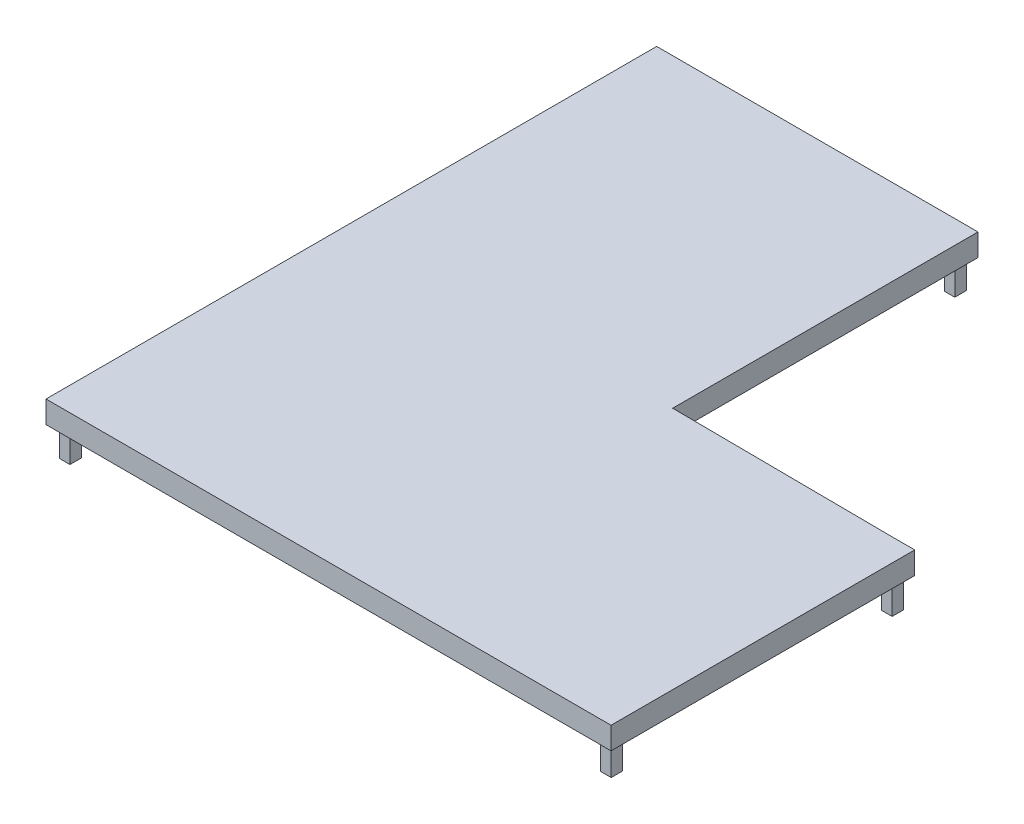
ISO-10303-21;
HEADER;
FILE_DESCRIPTION(('STEP AP214'),'2;1');
FILE_NAME('part.step','',(''),(''),'','','');
FILE_SCHEMA(('AUTOMOTIVE_DESIGN { 1 0 10303 214 1 1 1 1 }'));
ENDSEC;
DATA;
#1=APPLICATION_CONTEXT('core data for automotive mechanical design processes');
#2=APPLICATION_PROTOCOL_DEFINITION('international standard','automotive_design',2000,#1);
#3=PRODUCT_CONTEXT('',#1,'mechanical');
#4=PRODUCT('Part','Part','',(#3));
#5=PRODUCT_RELATED_PRODUCT_CATEGORY('part','',(#4));
#6=PRODUCT_DEFINITION_FORMATION('','',#4);
#7=PRODUCT_DEFINITION_CONTEXT('part definition',#1,'design');
#8=PRODUCT_DEFINITION('design','',#6,#7);
#9=PRODUCT_DEFINITION_SHAPE('','',#8);
#10=(LENGTH_UNIT() NAMED_UNIT(*) SI_UNIT(.MILLI.,.METRE.));
#11=(NAMED_UNIT(*) PLANE_ANGLE_UNIT() SI_UNIT($,.RADIAN.));
#12=(NAMED_UNIT(*) SI_UNIT($,.STERADIAN.) SOLID_ANGLE_UNIT());
#13=UNCERTAINTY_MEASURE_WITH_UNIT(LENGTH_MEASURE(1.E-05),#10,'distance_accuracy_value','');
#14=(GEOMETRIC_REPRESENTATION_CONTEXT(3) GLOBAL_UNCERTAINTY_ASSIGNED_CONTEXT((#13)) GLOBAL_UNIT_ASSIGNED_CONTEXT((#10,
#11,#12)) REPRESENTATION_CONTEXT('',''));
#15=CARTESIAN_POINT('',(0.,0.,0.));
#16=DIRECTION('',(0.,0.,1.));
#17=DIRECTION('',(1.,0.,0.));
#18=AXIS2_PLACEMENT_3D('',#15,#16,#17);
#19=CARTESIAN_POINT('',(0.,0.,0.));
#20=DIRECTION('',(0.,1.,0.));
#21=DIRECTION('',(0.,0.,1.));
#22=AXIS2_PLACEMENT_3D('',#19,#20,#21);
#23=PLANE('',#22);
#24=DIRECTION('',(-1.,0.,0.));
#25=VECTOR('',#24,1.);
#26=CARTESIAN_POINT('',(36.5271279898436,0.,10.5166417183787));
#27=LINE('',#26,#25);
#28=CARTESIAN_POINT('',(36.5271279898436,0.,10.5166417183787));
#29=VERTEX_POINT('',#28);
#30=CARTESIAN_POINT('',(32.7171279898436,0.,10.5166417183787));
#31=VERTEX_POINT('',#30);
#32=EDGE_CURVE('E316',#29,#31,#27,.T.);
#33=ORIENTED_EDGE('',*,*,#32,.F.);
#34=DIRECTION('',(0.,0.,1.));
#35=VECTOR('',#34,1.);
#36=CARTESIAN_POINT('',(36.5271279898436,0.,14.3266417183787));
#37=LINE('',#36,#35);
#38=CARTESIAN_POINT('',(36.5271279898436,0.,62.6094816829925));
#39=VERTEX_POINT('',#38);
#40=EDGE_CURVE('E328',#29,#39,#37,.T.);
#41=ORIENTED_EDGE('',*,*,#40,.T.);
#42=DIRECTION('',(-1.,0.,0.));
#43=VECTOR('',#42,1.);
#44=CARTESIAN_POINT('',(36.5271279898436,0.,62.6094816829925));
#45=LINE('',#44,#43);
#46=CARTESIAN_POINT('',(-60.4014319865656,0.,62.6094816829925));
#47=VERTEX_POINT('',#46);
#48=EDGE_CURVE('E358',#39,#47,#45,.T.);
#49=ORIENTED_EDGE('',*,*,#48,.T.);
#50=DIRECTION('',(0.,0.,-1.));
#51=VECTOR('',#50,1.);
#52=CARTESIAN_POINT('',(-60.4014319865656,0.,62.6094816829925));
#53=LINE('',#52,#51);
#54=CARTESIAN_POINT('',(-60.4014319865656,0.,-42.1433582816213));
#55=VERTEX_POINT('',#54);
#56=EDGE_CURVE('E355',#47,#55,#53,.T.);
#57=ORIENTED_EDGE('',*,*,#56,.T.);
#58=DIRECTION('',(1.,0.,0.));
#59=VECTOR('',#58,1.);
#60=CARTESIAN_POINT('',(-60.4014319865656,0.,-42.1433582816213));
#61=LINE('',#60,#59);
#62=CARTESIAN_POINT('',(-5.28143198656556,0.,-42.1433582816213));
#63=VERTEX_POINT('',#62);
#64=EDGE_CURVE('E353',#55,#63,#61,.T.);
#65=ORIENTED_EDGE('',*,*,#64,.T.);
#66=DIRECTION('',(0.,0.,-1.));
#67=VECTOR('',#66,1.);
#68=CARTESIAN_POINT('',(-5.28143198656556,0.,-38.3333582816213));
#69=LINE('',#68,#67);
#70=CARTESIAN_POINT('',(-5.28143198656556,0.,10.2330617006856));
#71=VERTEX_POINT('',#70);
#72=EDGE_CURVE('E350',#71,#63,#69,.T.);
#73=ORIENTED_EDGE('',*,*,#72,.F.);
#74=DIRECTION('',(0.999972153614113,0.,0.00746270703917655));
#75=VECTOR('',#74,1.);
#76=CARTESIAN_POINT('',(-5.28143198656556,0.,10.2330617006856));
#77=LINE('',#76,#75);
#78=EDGE_CURVE('E347',#71,#31,#77,.T.);
#79=ORIENTED_EDGE('',*,*,#78,.T.);
#80=EDGE_LOOP('',(#33,#41,#49,#57,#65,#73,#79));
#81=FACE_BOUND('',#80,.T.);
#82=DIRECTION('',(0.,0.,1.));
#83=VECTOR('',#82,1.);
#84=CARTESIAN_POINT('',(35.6745811420572,0.,0.));
#85=LINE('',#84,#83);
#86=CARTESIAN_POINT('',(35.6745811420572,0.,11.5764148682244));
#87=VERTEX_POINT('',#86);
#88=CARTESIAN_POINT('',(35.6745811420572,0.,13.5436908812878));
#89=VERTEX_POINT('',#88);
#90=EDGE_CURVE('E385',#87,#89,#85,.T.);
#91=ORIENTED_EDGE('',*,*,#90,.F.);
#92=DIRECTION('',(-1.,0.,0.));
#93=VECTOR('',#92,1.);
#94=CARTESIAN_POINT('',(0.,0.,11.5764148682244));
#95=LINE('',#94,#93);
#96=CARTESIAN_POINT('',(33.8682640755172,0.,11.5764148682244));
#97=VERTEX_POINT('',#96);
#98=EDGE_CURVE('E387',#87,#97,#95,.T.);
#99=ORIENTED_EDGE('',*,*,#98,.T.);
#100=DIRECTION('',(0.,0.,1.));
#101=VECTOR('',#100,1.);
#102=CARTESIAN_POINT('',(33.8682640755172,0.,0.));
#103=LINE('',#102,#101);
#104=CARTESIAN_POINT('',(33.8682640755172,0.,13.5436908812878));
#105=VERTEX_POINT('',#104);
#106=EDGE_CURVE('E379',#97,#105,#103,.T.);
#107=ORIENTED_EDGE('',*,*,#106,.T.);
#108=DIRECTION('',(-1.,0.,0.));
#109=VECTOR('',#108,1.);
#110=CARTESIAN_POINT('',(0.,0.,13.5436908812878));
#111=LINE('',#110,#109);
#112=EDGE_CURVE('E382',#89,#105,#111,.T.);
#113=ORIENTED_EDGE('',*,*,#112,.F.);
#114=EDGE_LOOP('',(#91,#99,#107,#113));
#115=FACE_BOUND('',#114,.T.);
#116=DIRECTION('',(0.,0.,1.));
#117=VECTOR('',#116,1.);
#118=CARTESIAN_POINT('',(-6.36491360532832,0.,0.));
#119=LINE('',#118,#117);
#120=CARTESIAN_POINT('',(-6.36491360532832,0.,-41.2194141822631));
#121=VERTEX_POINT('',#120);
#122=CARTESIAN_POINT('',(-6.36491360532832,0.,-39.2521381691998));
#123=VERTEX_POINT('',#122);
#124=EDGE_CURVE('E396',#121,#123,#119,.T.);
#125=ORIENTED_EDGE('',*,*,#124,.F.);
#126=DIRECTION('',(-1.,0.,0.));
#127=VECTOR('',#126,1.);
#128=CARTESIAN_POINT('',(0.,0.,-41.2194141822631));
#129=LINE('',#128,#127);
#130=CARTESIAN_POINT('',(-8.17123067186829,0.,-41.2194141822631));
#131=VERTEX_POINT('',#130);
#132=EDGE_CURVE('E398',#121,#131,#129,.T.);
#133=ORIENTED_EDGE('',*,*,#132,.T.);
#134=DIRECTION('',(0.,0.,1.));
#135=VECTOR('',#134,1.);
#136=CARTESIAN_POINT('',(-8.17123067186829,0.,0.));
#137=LINE('',#136,#135);
#138=CARTESIAN_POINT('',(-8.17123067186829,0.,-39.2521381691998));
#139=VERTEX_POINT('',#138);
#140=EDGE_CURVE('E390',#131,#139,#137,.T.);
#141=ORIENTED_EDGE('',*,*,#140,.T.);
#142=DIRECTION('',(-1.,0.,0.));
#143=VECTOR('',#142,1.);
#144=CARTESIAN_POINT('',(0.,0.,-39.2521381691998));
#145=LINE('',#144,#143);
#146=EDGE_CURVE('E393',#123,#139,#145,.T.);
#147=ORIENTED_EDGE('',*,*,#146,.F.);
#148=EDGE_LOOP('',(#125,#133,#141,#147));
#149=FACE_BOUND('',#148,.T.);
#150=DIRECTION('',(0.,0.,1.));
#151=VECTOR('',#150,1.);
#152=CARTESIAN_POINT('',(-57.6048939384726,0.,0.));
#153=LINE('',#152,#151);
#154=CARTESIAN_POINT('',(-57.6048939384726,0.,-40.9754424610887));
#155=VERTEX_POINT('',#154);
#156=CARTESIAN_POINT('',(-57.6048939384726,0.,-39.0081664480254));
#157=VERTEX_POINT('',#156);
#158=EDGE_CURVE('E407',#155,#157,#153,.T.);
#159=ORIENTED_EDGE('',*,*,#158,.F.);
#160=DIRECTION('',(-1.,0.,0.));
#161=VECTOR('',#160,1.);
#162=CARTESIAN_POINT('',(0.,0.,-40.9754424610887));
#163=LINE('',#162,#161);
#164=CARTESIAN_POINT('',(-59.4112110050125,0.,-40.9754424610887));
#165=VERTEX_POINT('',#164);
#166=EDGE_CURVE('E409',#155,#165,#163,.T.);
#167=ORIENTED_EDGE('',*,*,#166,.T.);
#168=DIRECTION('',(0.,0.,1.));
#169=VECTOR('',#168,1.);
#170=CARTESIAN_POINT('',(-59.4112110050125,0.,0.));
#171=LINE('',#170,#169);
#172=CARTESIAN_POINT('',(-59.4112110050125,0.,-39.0081664480254));
#173=VERTEX_POINT('',#172);
#174=EDGE_CURVE('E401',#165,#173,#171,.T.);
#175=ORIENTED_EDGE('',*,*,#174,.T.);
#176=DIRECTION('',(-1.,0.,0.));
#177=VECTOR('',#176,1.);
#178=CARTESIAN_POINT('',(0.,0.,-39.0081664480254));
#179=LINE('',#178,#177);
#180=EDGE_CURVE('E404',#157,#173,#179,.T.);
#181=ORIENTED_EDGE('',*,*,#180,.F.);
#182=EDGE_LOOP('',(#159,#167,#175,#181));
#183=FACE_BOUND('',#182,.T.);
#184=DIRECTION('',(0.,0.,1.));
#185=VECTOR('',#184,1.);
#186=CARTESIAN_POINT('',(-57.4079842203451,0.,0.));
#187=LINE('',#186,#185);
#188=CARTESIAN_POINT('',(-57.4079842203451,0.,59.5240247179649));
#189=VERTEX_POINT('',#188);
#190=CARTESIAN_POINT('',(-57.4079842203451,0.,61.4913007310282));
#191=VERTEX_POINT('',#190);
#192=EDGE_CURVE('E417',#189,#191,#187,.T.);
#193=ORIENTED_EDGE('',*,*,#192,.F.);
#194=DIRECTION('',(-1.,0.,0.));
#195=VECTOR('',#194,1.);
#196=CARTESIAN_POINT('',(0.,0.,59.5240247179649));
#197=LINE('',#196,#195);
#198=CARTESIAN_POINT('',(-59.2143012868851,0.,59.5240247179649));
#199=VERTEX_POINT('',#198);
#200=EDGE_CURVE('E419',#189,#199,#197,.T.);
#201=ORIENTED_EDGE('',*,*,#200,.T.);
#202=DIRECTION('',(0.,0.,1.));
#203=VECTOR('',#202,1.);
#204=CARTESIAN_POINT('',(-59.2143012868851,0.,0.));
#205=LINE('',#204,#203);
#206=CARTESIAN_POINT('',(-59.2143012868851,0.,61.4913007310282));
#207=VERTEX_POINT('',#206);
#208=EDGE_CURVE('E412',#199,#207,#205,.T.);
#209=ORIENTED_EDGE('',*,*,#208,.T.);
#210=DIRECTION('',(-1.,0.,0.));
#211=VECTOR('',#210,1.);
#212=CARTESIAN_POINT('',(0.,0.,61.4913007310282));
#213=LINE('',#212,#211);
#214=EDGE_CURVE('E415',#191,#207,#213,.T.);
#215=ORIENTED_EDGE('',*,*,#214,.F.);
#216=EDGE_LOOP('',(#193,#201,#209,#215));
#217=FACE_BOUND('',#216,.T.);
#218=DIRECTION('',(0.,0.,1.));
#219=VECTOR('',#218,1.);
#220=CARTESIAN_POINT('',(35.5174807960676,0.,0.));
#221=LINE('',#220,#219);
#222=CARTESIAN_POINT('',(35.5174807960676,0.,59.6059888293385));
#223=VERTEX_POINT('',#222);
#224=CARTESIAN_POINT('',(35.5174807960676,0.,61.5732648424018));
#225=VERTEX_POINT('',#224);
#226=EDGE_CURVE('E11',#223,#225,#221,.T.);
#227=ORIENTED_EDGE('',*,*,#226,.F.);
#228=DIRECTION('',(-1.,0.,0.));
#229=VECTOR('',#228,1.);
#230=CARTESIAN_POINT('',(0.,0.,59.6059888293385));
#231=LINE('',#230,#229);
#232=CARTESIAN_POINT('',(33.7111637295277,0.,59.6059888293385));
#233=VERTEX_POINT('',#232);
#234=EDGE_CURVE('E219',#223,#233,#231,.T.);
#235=ORIENTED_EDGE('',*,*,#234,.T.);
#236=DIRECTION('',(0.,0.,1.));
#237=VECTOR('',#236,1.);
#238=CARTESIAN_POINT('',(33.7111637295277,0.,0.));
#239=LINE('',#238,#237);
#240=CARTESIAN_POINT('',(33.7111637295277,0.,61.5732648424018));
#241=VERTEX_POINT('',#240);
#242=EDGE_CURVE('E423',#233,#241,#239,.T.);
#243=ORIENTED_EDGE('',*,*,#242,.T.);
#244=DIRECTION('',(-1.,0.,0.));
#245=VECTOR('',#244,1.);
#246=CARTESIAN_POINT('',(0.,0.,61.5732648424018));
#247=LINE('',#246,#245);
#248=EDGE_CURVE('E44',#225,#241,#247,.T.);
#249=ORIENTED_EDGE('',*,*,#248,.F.);
#250=EDGE_LOOP('',(#227,#235,#243,#249));
#251=FACE_BOUND('',#250,.T.);
#252=ADVANCED_FACE('F36',(#81,#115,#149,#183,#217,#251),#23,.F.);
#253=CARTESIAN_POINT('',(36.5271279898436,3.81,10.5166417183787));
#254=DIRECTION('',(0.,0.,1.));
#255=DIRECTION('',(1.,0.,0.));
#256=AXIS2_PLACEMENT_3D('',#253,#254,#255);
#257=PLANE('',#256);
#258=ORIENTED_EDGE('',*,*,#32,.T.);
#259=DIRECTION('',(0.,-1.,0.));
#260=VECTOR('',#259,1.);
#261=CARTESIAN_POINT('',(32.7171279898436,3.81,10.5166417183787));
#262=LINE('',#261,#260);
#263=CARTESIAN_POINT('',(32.7171279898436,3.81,10.5166417183787));
#264=VERTEX_POINT('',#263);
#265=EDGE_CURVE('E374',#264,#31,#262,.T.);
#266=ORIENTED_EDGE('',*,*,#265,.F.);
#267=DIRECTION('',(-1.,0.,0.));
#268=VECTOR('',#267,1.);
#269=CARTESIAN_POINT('',(36.5271279898436,3.81,10.5166417183787));
#270=LINE('',#269,#268);
#271=CARTESIAN_POINT('',(36.5271279898436,3.81,10.5166417183787));
#272=VERTEX_POINT('',#271);
#273=EDGE_CURVE('E327',#272,#264,#270,.T.);
#274=ORIENTED_EDGE('',*,*,#273,.F.);
#275=DIRECTION('',(0.,-1.,0.));
#276=VECTOR('',#275,1.);
#277=CARTESIAN_POINT('',(36.5271279898436,3.81,10.5166417183787));
#278=LINE('',#277,#276);
#279=EDGE_CURVE('E376',#272,#29,#278,.T.);
#280=ORIENTED_EDGE('',*,*,#279,.T.);
#281=EDGE_LOOP('',(#258,#266,#274,#280));
#282=FACE_BOUND('',#281,.T.);
#283=ADVANCED_FACE('F38',(#282),#257,.F.);
#284=CARTESIAN_POINT('',(-5.28143198656556,3.81,10.2330617006856));
#285=DIRECTION('',(0.00746270703917655,0.,-0.999972153614113));
#286=DIRECTION('',(-0.999972153614113,0.,-0.00746270703917655));
#287=AXIS2_PLACEMENT_3D('',#284,#285,#286);
#288=PLANE('',#287);
#289=ORIENTED_EDGE('',*,*,#78,.F.);
#290=DIRECTION('',(0.,-1.,0.));
#291=VECTOR('',#290,1.);
#292=CARTESIAN_POINT('',(-5.28143198656556,3.81,10.2330617006856));
#293=LINE('',#292,#291);
#294=CARTESIAN_POINT('',(-5.28143198656556,3.81,10.2330617006856));
#295=VERTEX_POINT('',#294);
#296=EDGE_CURVE('E371',#295,#71,#293,.T.);
#297=ORIENTED_EDGE('',*,*,#296,.F.);
#298=DIRECTION('',(0.999972153614113,0.,0.00746270703917655));
#299=VECTOR('',#298,1.);
#300=CARTESIAN_POINT('',(-5.28143198656556,3.81,10.2330617006856));
#301=LINE('',#300,#299);
#302=EDGE_CURVE('E330',#295,#264,#301,.T.);
#303=ORIENTED_EDGE('',*,*,#302,.T.);
#304=ORIENTED_EDGE('',*,*,#265,.T.);
#305=EDGE_LOOP('',(#289,#297,#303,#304));
#306=FACE_BOUND('',#305,.T.);
#307=ADVANCED_FACE('F441',(#306),#288,.T.);
#308=CARTESIAN_POINT('',(-5.28143198656556,3.81,-38.3333582816213));
#309=DIRECTION('',(-1.,0.,0.));
#310=DIRECTION('',(0.,0.,1.));
#311=AXIS2_PLACEMENT_3D('',#308,#309,#310);
#312=PLANE('',#311);
#313=ORIENTED_EDGE('',*,*,#72,.T.);
#314=DIRECTION('',(0.,-1.,0.));
#315=VECTOR('',#314,1.);
#316=CARTESIAN_POINT('',(-5.28143198656556,3.81,-42.1433582816213));
#317=LINE('',#316,#315);
#318=CARTESIAN_POINT('',(-5.28143198656556,3.81,-42.1433582816213));
#319=VERTEX_POINT('',#318);
#320=EDGE_CURVE('E368',#319,#63,#317,.T.);
#321=ORIENTED_EDGE('',*,*,#320,.F.);
#322=DIRECTION('',(0.,0.,-1.));
#323=VECTOR('',#322,1.);
#324=CARTESIAN_POINT('',(-5.28143198656556,3.81,10.2330617006856));
#325=LINE('',#324,#323);
#326=EDGE_CURVE('E333',#295,#319,#325,.T.);
#327=ORIENTED_EDGE('',*,*,#326,.F.);
#328=ORIENTED_EDGE('',*,*,#296,.T.);
#329=EDGE_LOOP('',(#313,#321,#327,#328));
#330=FACE_BOUND('',#329,.T.);
#331=ADVANCED_FACE('F464',(#330),#312,.F.);
#332=CARTESIAN_POINT('',(-60.4014319865656,3.81,-42.1433582816213));
#333=DIRECTION('',(0.,0.,-1.));
#334=DIRECTION('',(-1.,0.,0.));
#335=AXIS2_PLACEMENT_3D('',#332,#333,#334);
#336=PLANE('',#335);
#337=ORIENTED_EDGE('',*,*,#64,.F.);
#338=DIRECTION('',(0.,-1.,0.));
#339=VECTOR('',#338,1.);
#340=CARTESIAN_POINT('',(-60.4014319865656,3.81,-42.1433582816213));
#341=LINE('',#340,#339);
#342=CARTESIAN_POINT('',(-60.4014319865656,3.81,-42.1433582816213));
#343=VERTEX_POINT('',#342);
#344=EDGE_CURVE('E366',#343,#55,#341,.T.);
#345=ORIENTED_EDGE('',*,*,#344,.F.);
#346=DIRECTION('',(1.,0.,0.));
#347=VECTOR('',#346,1.);
#348=CARTESIAN_POINT('',(-9.09143198656556,3.81,-42.1433582816213));
#349=LINE('',#348,#347);
#350=EDGE_CURVE('E335',#343,#319,#349,.T.);
#351=ORIENTED_EDGE('',*,*,#350,.T.);
#352=ORIENTED_EDGE('',*,*,#320,.T.);
#353=EDGE_LOOP('',(#337,#345,#351,#352));
#354=FACE_BOUND('',#353,.T.);
#355=ADVANCED_FACE('F460',(#354),#336,.T.);
#356=CARTESIAN_POINT('',(-60.4014319865656,3.81,62.6094816829925));
#357=DIRECTION('',(-1.,0.,0.));
#358=DIRECTION('',(0.,0.,1.));
#359=AXIS2_PLACEMENT_3D('',#356,#357,#358);
#360=PLANE('',#359);
#361=ORIENTED_EDGE('',*,*,#56,.F.);
#362=DIRECTION('',(0.,-1.,0.));
#363=VECTOR('',#362,1.);
#364=CARTESIAN_POINT('',(-60.4014319865656,3.81,62.6094816829925));
#365=LINE('',#364,#363);
#366=CARTESIAN_POINT('',(-60.4014319865656,3.81,62.6094816829925));
#367=VERTEX_POINT('',#366);
#368=EDGE_CURVE('E364',#367,#47,#365,.T.);
#369=ORIENTED_EDGE('',*,*,#368,.F.);
#370=DIRECTION('',(0.,0.,-1.));
#371=VECTOR('',#370,1.);
#372=CARTESIAN_POINT('',(-60.4014319865656,3.81,62.6094816829925));
#373=LINE('',#372,#371);
#374=EDGE_CURVE('E338',#367,#343,#373,.T.);
#375=ORIENTED_EDGE('',*,*,#374,.T.);
#376=ORIENTED_EDGE('',*,*,#344,.T.);
#377=EDGE_LOOP('',(#361,#369,#375,#376));
#378=FACE_BOUND('',#377,.T.);
#379=ADVANCED_FACE('F456',(#378),#360,.T.);
#380=CARTESIAN_POINT('',(36.5271279898436,3.81,62.6094816829925));
#381=DIRECTION('',(0.,0.,1.));
#382=DIRECTION('',(1.,0.,0.));
#383=AXIS2_PLACEMENT_3D('',#380,#381,#382);
#384=PLANE('',#383);
#385=ORIENTED_EDGE('',*,*,#48,.F.);
#386=DIRECTION('',(0.,-1.,0.));
#387=VECTOR('',#386,1.);
#388=CARTESIAN_POINT('',(36.5271279898436,3.81,62.6094816829925));
#389=LINE('',#388,#387);
#390=CARTESIAN_POINT('',(36.5271279898436,3.81,62.6094816829925));
#391=VERTEX_POINT('',#390);
#392=EDGE_CURVE('E344',#391,#39,#389,.T.);
#393=ORIENTED_EDGE('',*,*,#392,.F.);
#394=DIRECTION('',(-1.,0.,0.));
#395=VECTOR('',#394,1.);
#396=CARTESIAN_POINT('',(36.5271279898436,3.81,62.6094816829925));
#397=LINE('',#396,#395);
#398=EDGE_CURVE('E341',#391,#367,#397,.T.);
#399=ORIENTED_EDGE('',*,*,#398,.T.);
#400=ORIENTED_EDGE('',*,*,#368,.T.);
#401=EDGE_LOOP('',(#385,#393,#399,#400));
#402=FACE_BOUND('',#401,.T.);
#403=ADVANCED_FACE('F452',(#402),#384,.T.);
#404=CARTESIAN_POINT('',(36.5271279898436,3.81,14.3266417183787));
#405=DIRECTION('',(1.,0.,0.));
#406=DIRECTION('',(0.,0.,-1.));
#407=AXIS2_PLACEMENT_3D('',#404,#405,#406);
#408=PLANE('',#407);
#409=ORIENTED_EDGE('',*,*,#40,.F.);
#410=ORIENTED_EDGE('',*,*,#279,.F.);
#411=DIRECTION('',(0.,0.,-1.));
#412=VECTOR('',#411,1.);
#413=CARTESIAN_POINT('',(36.5271279898436,3.81,14.3266417183787));
#414=LINE('',#413,#412);
#415=EDGE_CURVE('E324',#391,#272,#414,.T.);
#416=ORIENTED_EDGE('',*,*,#415,.F.);
#417=ORIENTED_EDGE('',*,*,#392,.T.);
#418=EDGE_LOOP('',(#409,#410,#416,#417));
#419=FACE_BOUND('',#418,.T.);
#420=ADVANCED_FACE('F449',(#419),#408,.T.);
#421=CARTESIAN_POINT('',(0.,3.81,0.));
#422=DIRECTION('',(0.,1.,0.));
#423=DIRECTION('',(0.,0.,1.));
#424=AXIS2_PLACEMENT_3D('',#421,#422,#423);
#425=PLANE('',#424);
#426=ORIENTED_EDGE('',*,*,#415,.T.);
#427=ORIENTED_EDGE('',*,*,#273,.T.);
#428=ORIENTED_EDGE('',*,*,#302,.F.);
#429=ORIENTED_EDGE('',*,*,#326,.T.);
#430=ORIENTED_EDGE('',*,*,#350,.F.);
#431=ORIENTED_EDGE('',*,*,#374,.F.);
#432=ORIENTED_EDGE('',*,*,#398,.F.);
#433=EDGE_LOOP('',(#426,#427,#428,#429,#430,#431,#432));
#434=FACE_BOUND('',#433,.T.);
#435=ADVANCED_FACE('F447',(#434),#425,.T.);
#436=CARTESIAN_POINT('',(0.,-4.99,11.5764148682244));
#437=DIRECTION('',(0.,0.,-1.));
#438=DIRECTION('',(-1.,0.,0.));
#439=AXIS2_PLACEMENT_3D('',#436,#437,#438);
#440=PLANE('',#439);
#441=ORIENTED_EDGE('',*,*,#98,.F.);
#442=DIRECTION('',(0.,1.,0.));
#443=VECTOR('',#442,1.);
#444=CARTESIAN_POINT('',(35.6745811420572,-4.99,11.5764148682244));
#445=LINE('',#444,#443);
#446=CARTESIAN_POINT('',(35.6745811420572,-4.99,11.5764148682244));
#447=VERTEX_POINT('',#446);
#448=EDGE_CURVE('E313',#447,#87,#445,.T.);
#449=ORIENTED_EDGE('',*,*,#448,.F.);
#450=DIRECTION('',(-1.,0.,0.));
#451=VECTOR('',#450,1.);
#452=CARTESIAN_POINT('',(0.,-4.99,11.5764148682244));
#453=LINE('',#452,#451);
#454=CARTESIAN_POINT('',(33.8682640755172,-4.99,11.5764148682244));
#455=VERTEX_POINT('',#454);
#456=EDGE_CURVE('E302',#447,#455,#453,.T.);
#457=ORIENTED_EDGE('',*,*,#456,.T.);
#458=DIRECTION('',(0.,1.,0.));
#459=VECTOR('',#458,1.);
#460=CARTESIAN_POINT('',(33.8682640755172,-4.99,11.5764148682244));
#461=LINE('',#460,#459);
#462=EDGE_CURVE('E312',#455,#97,#461,.T.);
#463=ORIENTED_EDGE('',*,*,#462,.T.);
#464=EDGE_LOOP('',(#441,#449,#457,#463));
#465=FACE_BOUND('',#464,.T.);
#466=ADVANCED_FACE('F487',(#465),#440,.T.);
#467=CARTESIAN_POINT('',(35.6745811420572,-4.99,0.));
#468=DIRECTION('',(-1.,0.,0.));
#469=DIRECTION('',(0.,0.,1.));
#470=AXIS2_PLACEMENT_3D('',#467,#468,#469);
#471=PLANE('',#470);
#472=ORIENTED_EDGE('',*,*,#448,.T.);
#473=ORIENTED_EDGE('',*,*,#90,.T.);
#474=DIRECTION('',(0.,1.,0.));
#475=VECTOR('',#474,1.);
#476=CARTESIAN_POINT('',(35.6745811420572,-4.99,13.5436908812878));
#477=LINE('',#476,#475);
#478=CARTESIAN_POINT('',(35.6745811420572,-4.99,13.5436908812878));
#479=VERTEX_POINT('',#478);
#480=EDGE_CURVE('E317',#479,#89,#477,.T.);
#481=ORIENTED_EDGE('',*,*,#480,.F.);
#482=DIRECTION('',(0.,0.,1.));
#483=VECTOR('',#482,1.);
#484=CARTESIAN_POINT('',(35.6745811420572,-4.99,0.));
#485=LINE('',#484,#483);
#486=EDGE_CURVE('E310',#447,#479,#485,.T.);
#487=ORIENTED_EDGE('',*,*,#486,.F.);
#488=EDGE_LOOP('',(#472,#473,#481,#487));
#489=FACE_BOUND('',#488,.T.);
#490=ADVANCED_FACE('F491',(#489),#471,.F.);
#491=CARTESIAN_POINT('',(0.,-4.99,13.5436908812878));
#492=DIRECTION('',(0.,0.,-1.));
#493=DIRECTION('',(-1.,0.,0.));
#494=AXIS2_PLACEMENT_3D('',#491,#492,#493);
#495=PLANE('',#494);
#496=ORIENTED_EDGE('',*,*,#480,.T.);
#497=ORIENTED_EDGE('',*,*,#112,.T.);
#498=DIRECTION('',(0.,1.,0.));
#499=VECTOR('',#498,1.);
#500=CARTESIAN_POINT('',(33.8682640755172,-4.99,13.5436908812878));
#501=LINE('',#500,#499);
#502=CARTESIAN_POINT('',(33.8682640755172,-4.99,13.5436908812878));
#503=VERTEX_POINT('',#502);
#504=EDGE_CURVE('E320',#503,#105,#501,.T.);
#505=ORIENTED_EDGE('',*,*,#504,.F.);
#506=DIRECTION('',(-1.,0.,0.));
#507=VECTOR('',#506,1.);
#508=CARTESIAN_POINT('',(0.,-4.99,13.5436908812878));
#509=LINE('',#508,#507);
#510=EDGE_CURVE('E308',#479,#503,#509,.T.);
#511=ORIENTED_EDGE('',*,*,#510,.F.);
#512=EDGE_LOOP('',(#496,#497,#505,#511));
#513=FACE_BOUND('',#512,.T.);
#514=ADVANCED_FACE('F496',(#513),#495,.F.);
#515=CARTESIAN_POINT('',(33.8682640755172,-4.99,0.));
#516=DIRECTION('',(-1.,0.,0.));
#517=DIRECTION('',(0.,0.,1.));
#518=AXIS2_PLACEMENT_3D('',#515,#516,#517);
#519=PLANE('',#518);
#520=ORIENTED_EDGE('',*,*,#106,.F.);
#521=ORIENTED_EDGE('',*,*,#462,.F.);
#522=DIRECTION('',(0.,0.,1.));
#523=VECTOR('',#522,1.);
#524=CARTESIAN_POINT('',(33.8682640755172,-4.99,0.));
#525=LINE('',#524,#523);
#526=EDGE_CURVE('E305',#455,#503,#525,.T.);
#527=ORIENTED_EDGE('',*,*,#526,.T.);
#528=ORIENTED_EDGE('',*,*,#504,.T.);
#529=EDGE_LOOP('',(#520,#521,#527,#528));
#530=FACE_BOUND('',#529,.T.);
#531=ADVANCED_FACE('F500',(#530),#519,.T.);
#532=CARTESIAN_POINT('',(0.,-4.99,0.));
#533=DIRECTION('',(0.,1.,0.));
#534=DIRECTION('',(0.,0.,1.));
#535=AXIS2_PLACEMENT_3D('',#532,#533,#534);
#536=PLANE('',#535);
#537=ORIENTED_EDGE('',*,*,#456,.F.);
#538=ORIENTED_EDGE('',*,*,#486,.T.);
#539=ORIENTED_EDGE('',*,*,#510,.T.);
#540=ORIENTED_EDGE('',*,*,#526,.F.);
#541=EDGE_LOOP('',(#537,#538,#539,#540));
#542=FACE_BOUND('',#541,.T.);
#543=ADVANCED_FACE('F503',(#542),#536,.F.);
#544=CARTESIAN_POINT('',(0.,-4.99,-41.2194141822631));
#545=DIRECTION('',(0.,0.,-1.));
#546=DIRECTION('',(-1.,0.,0.));
#547=AXIS2_PLACEMENT_3D('',#544,#545,#546);
#548=PLANE('',#547);
#549=ORIENTED_EDGE('',*,*,#132,.F.);
#550=DIRECTION('',(0.,1.,0.));
#551=VECTOR('',#550,1.);
#552=CARTESIAN_POINT('',(-6.36491360532832,-4.99,-41.2194141822631));
#553=LINE('',#552,#551);
#554=CARTESIAN_POINT('',(-6.36491360532832,-4.99,-41.2194141822631));
#555=VERTEX_POINT('',#554);
#556=EDGE_CURVE('E281',#555,#121,#553,.T.);
#557=ORIENTED_EDGE('',*,*,#556,.F.);
#558=DIRECTION('',(-1.,0.,0.));
#559=VECTOR('',#558,1.);
#560=CARTESIAN_POINT('',(0.,-4.99,-41.2194141822631));
#561=LINE('',#560,#559);
#562=CARTESIAN_POINT('',(-8.17123067186829,-4.99,-41.2194141822631));
#563=VERTEX_POINT('',#562);
#564=EDGE_CURVE('E299',#555,#563,#561,.T.);
#565=ORIENTED_EDGE('',*,*,#564,.T.);
#566=DIRECTION('',(0.,1.,0.));
#567=VECTOR('',#566,1.);
#568=CARTESIAN_POINT('',(-8.17123067186829,-4.99,-41.2194141822631));
#569=LINE('',#568,#567);
#570=EDGE_CURVE('E282',#563,#131,#569,.T.);
#571=ORIENTED_EDGE('',*,*,#570,.T.);
#572=EDGE_LOOP('',(#549,#557,#565,#571));
#573=FACE_BOUND('',#572,.T.);
#574=ADVANCED_FACE('F510',(#573),#548,.T.);
#575=CARTESIAN_POINT('',(-6.36491360532832,-4.99,0.));
#576=DIRECTION('',(-1.,0.,0.));
#577=DIRECTION('',(0.,0.,1.));
#578=AXIS2_PLACEMENT_3D('',#575,#576,#577);
#579=PLANE('',#578);
#580=ORIENTED_EDGE('',*,*,#556,.T.);
#581=ORIENTED_EDGE('',*,*,#124,.T.);
#582=DIRECTION('',(0.,1.,0.));
#583=VECTOR('',#582,1.);
#584=CARTESIAN_POINT('',(-6.36491360532832,-4.99,-39.2521381691998));
#585=LINE('',#584,#583);
#586=CARTESIAN_POINT('',(-6.36491360532832,-4.99,-39.2521381691998));
#587=VERTEX_POINT('',#586);
#588=EDGE_CURVE('E288',#587,#123,#585,.T.);
#589=ORIENTED_EDGE('',*,*,#588,.F.);
#590=DIRECTION('',(0.,0.,1.));
#591=VECTOR('',#590,1.);
#592=CARTESIAN_POINT('',(-6.36491360532832,-4.99,0.));
#593=LINE('',#592,#591);
#594=EDGE_CURVE('E285',#555,#587,#593,.T.);
#595=ORIENTED_EDGE('',*,*,#594,.F.);
#596=EDGE_LOOP('',(#580,#581,#589,#595));
#597=FACE_BOUND('',#596,.T.);
#598=ADVANCED_FACE('F518',(#597),#579,.F.);
#599=CARTESIAN_POINT('',(0.,-4.99,-39.2521381691998));
#600=DIRECTION('',(0.,0.,-1.));
#601=DIRECTION('',(-1.,0.,0.));
#602=AXIS2_PLACEMENT_3D('',#599,#600,#601);
#603=PLANE('',#602);
#604=ORIENTED_EDGE('',*,*,#588,.T.);
#605=ORIENTED_EDGE('',*,*,#146,.T.);
#606=DIRECTION('',(0.,1.,0.));
#607=VECTOR('',#606,1.);
#608=CARTESIAN_POINT('',(-8.17123067186829,-4.99,-39.2521381691998));
#609=LINE('',#608,#607);
#610=CARTESIAN_POINT('',(-8.17123067186829,-4.99,-39.2521381691998));
#611=VERTEX_POINT('',#610);
#612=EDGE_CURVE('E286',#611,#139,#609,.T.);
#613=ORIENTED_EDGE('',*,*,#612,.F.);
#614=DIRECTION('',(-1.,0.,0.));
#615=VECTOR('',#614,1.);
#616=CARTESIAN_POINT('',(0.,-4.99,-39.2521381691998));
#617=LINE('',#616,#615);
#618=EDGE_CURVE('E294',#587,#611,#617,.T.);
#619=ORIENTED_EDGE('',*,*,#618,.F.);
#620=EDGE_LOOP('',(#604,#605,#613,#619));
#621=FACE_BOUND('',#620,.T.);
#622=ADVANCED_FACE('F521',(#621),#603,.F.);
#623=CARTESIAN_POINT('',(-8.17123067186829,-4.99,0.));
#624=DIRECTION('',(-1.,0.,0.));
#625=DIRECTION('',(0.,0.,1.));
#626=AXIS2_PLACEMENT_3D('',#623,#624,#625);
#627=PLANE('',#626);
#628=ORIENTED_EDGE('',*,*,#140,.F.);
#629=ORIENTED_EDGE('',*,*,#570,.F.);
#630=DIRECTION('',(0.,0.,1.));
#631=VECTOR('',#630,1.);
#632=CARTESIAN_POINT('',(-8.17123067186829,-4.99,0.));
#633=LINE('',#632,#631);
#634=EDGE_CURVE('E296',#563,#611,#633,.T.);
#635=ORIENTED_EDGE('',*,*,#634,.T.);
#636=ORIENTED_EDGE('',*,*,#612,.T.);
#637=EDGE_LOOP('',(#628,#629,#635,#636));
#638=FACE_BOUND('',#637,.T.);
#639=ADVANCED_FACE('F516',(#638),#627,.T.);
#640=CARTESIAN_POINT('',(0.,-4.99,0.));
#641=DIRECTION('',(0.,1.,0.));
#642=DIRECTION('',(0.,0.,1.));
#643=AXIS2_PLACEMENT_3D('',#640,#641,#642);
#644=PLANE('',#643);
#645=ORIENTED_EDGE('',*,*,#564,.F.);
#646=ORIENTED_EDGE('',*,*,#594,.T.);
#647=ORIENTED_EDGE('',*,*,#618,.T.);
#648=ORIENTED_EDGE('',*,*,#634,.F.);
#649=EDGE_LOOP('',(#645,#646,#647,#648));
#650=FACE_BOUND('',#649,.T.);
#651=ADVANCED_FACE('F512',(#650),#644,.F.);
#652=CARTESIAN_POINT('',(0.,-4.99,-40.9754424610887));
#653=DIRECTION('',(0.,0.,-1.));
#654=DIRECTION('',(-1.,0.,0.));
#655=AXIS2_PLACEMENT_3D('',#652,#653,#654);
#656=PLANE('',#655);
#657=ORIENTED_EDGE('',*,*,#166,.F.);
#658=DIRECTION('',(0.,1.,0.));
#659=VECTOR('',#658,1.);
#660=CARTESIAN_POINT('',(-57.6048939384726,-4.99,-40.9754424610887));
#661=LINE('',#660,#659);
#662=CARTESIAN_POINT('',(-57.6048939384726,-4.99,-40.9754424610887));
#663=VERTEX_POINT('',#662);
#664=EDGE_CURVE('E260',#663,#155,#661,.T.);
#665=ORIENTED_EDGE('',*,*,#664,.F.);
#666=DIRECTION('',(-1.,0.,0.));
#667=VECTOR('',#666,1.);
#668=CARTESIAN_POINT('',(0.,-4.99,-40.9754424610887));
#669=LINE('',#668,#667);
#670=CARTESIAN_POINT('',(-59.4112110050125,-4.99,-40.9754424610887));
#671=VERTEX_POINT('',#670);
#672=EDGE_CURVE('E278',#663,#671,#669,.T.);
#673=ORIENTED_EDGE('',*,*,#672,.T.);
#674=DIRECTION('',(0.,1.,0.));
#675=VECTOR('',#674,1.);
#676=CARTESIAN_POINT('',(-59.4112110050125,-4.99,-40.9754424610887));
#677=LINE('',#676,#675);
#678=EDGE_CURVE('E261',#671,#165,#677,.T.);
#679=ORIENTED_EDGE('',*,*,#678,.T.);
#680=EDGE_LOOP('',(#657,#665,#673,#679));
#681=FACE_BOUND('',#680,.T.);
#682=ADVANCED_FACE('F515',(#681),#656,.T.);
#683=CARTESIAN_POINT('',(-57.6048939384726,-4.99,0.));
#684=DIRECTION('',(-1.,0.,0.));
#685=DIRECTION('',(0.,0.,1.));
#686=AXIS2_PLACEMENT_3D('',#683,#684,#685);
#687=PLANE('',#686);
#688=ORIENTED_EDGE('',*,*,#664,.T.);
#689=ORIENTED_EDGE('',*,*,#158,.T.);
#690=DIRECTION('',(0.,1.,0.));
#691=VECTOR('',#690,1.);
#692=CARTESIAN_POINT('',(-57.6048939384726,-4.99,-39.0081664480254));
#693=LINE('',#692,#691);
#694=CARTESIAN_POINT('',(-57.6048939384726,-4.99,-39.0081664480254));
#695=VERTEX_POINT('',#694);
#696=EDGE_CURVE('E267',#695,#157,#693,.T.);
#697=ORIENTED_EDGE('',*,*,#696,.F.);
#698=DIRECTION('',(0.,0.,1.));
#699=VECTOR('',#698,1.);
#700=CARTESIAN_POINT('',(-57.6048939384726,-4.99,0.));
#701=LINE('',#700,#699);
#702=EDGE_CURVE('E264',#663,#695,#701,.T.);
#703=ORIENTED_EDGE('',*,*,#702,.F.);
#704=EDGE_LOOP('',(#688,#689,#697,#703));
#705=FACE_BOUND('',#704,.T.);
#706=ADVANCED_FACE('F538',(#705),#687,.F.);
#707=CARTESIAN_POINT('',(0.,-4.99,-39.0081664480254));
#708=DIRECTION('',(0.,0.,-1.));
#709=DIRECTION('',(-1.,0.,0.));
#710=AXIS2_PLACEMENT_3D('',#707,#708,#709);
#711=PLANE('',#710);
#712=ORIENTED_EDGE('',*,*,#696,.T.);
#713=ORIENTED_EDGE('',*,*,#180,.T.);
#714=DIRECTION('',(0.,1.,0.));
#715=VECTOR('',#714,1.);
#716=CARTESIAN_POINT('',(-59.4112110050125,-4.99,-39.0081664480254));
#717=LINE('',#716,#715);
#718=CARTESIAN_POINT('',(-59.4112110050125,-4.99,-39.0081664480254));
#719=VERTEX_POINT('',#718);
#720=EDGE_CURVE('E265',#719,#173,#717,.T.);
#721=ORIENTED_EDGE('',*,*,#720,.F.);
#722=DIRECTION('',(-1.,0.,0.));
#723=VECTOR('',#722,1.);
#724=CARTESIAN_POINT('',(0.,-4.99,-39.0081664480254));
#725=LINE('',#724,#723);
#726=EDGE_CURVE('E273',#695,#719,#725,.T.);
#727=ORIENTED_EDGE('',*,*,#726,.F.);
#728=EDGE_LOOP('',(#712,#713,#721,#727));
#729=FACE_BOUND('',#728,.T.);
#730=ADVANCED_FACE('F541',(#729),#711,.F.);
#731=CARTESIAN_POINT('',(-59.4112110050125,-4.99,0.));
#732=DIRECTION('',(-1.,0.,0.));
#733=DIRECTION('',(0.,0.,1.));
#734=AXIS2_PLACEMENT_3D('',#731,#732,#733);
#735=PLANE('',#734);
#736=ORIENTED_EDGE('',*,*,#174,.F.);
#737=ORIENTED_EDGE('',*,*,#678,.F.);
#738=DIRECTION('',(0.,0.,1.));
#739=VECTOR('',#738,1.);
#740=CARTESIAN_POINT('',(-59.4112110050125,-4.99,0.));
#741=LINE('',#740,#739);
#742=EDGE_CURVE('E275',#671,#719,#741,.T.);
#743=ORIENTED_EDGE('',*,*,#742,.T.);
#744=ORIENTED_EDGE('',*,*,#720,.T.);
#745=EDGE_LOOP('',(#736,#737,#743,#744));
#746=FACE_BOUND('',#745,.T.);
#747=ADVANCED_FACE('F536',(#746),#735,.T.);
#748=CARTESIAN_POINT('',(0.,-4.99,0.));
#749=DIRECTION('',(0.,1.,0.));
#750=DIRECTION('',(0.,0.,1.));
#751=AXIS2_PLACEMENT_3D('',#748,#749,#750);
#752=PLANE('',#751);
#753=ORIENTED_EDGE('',*,*,#672,.F.);
#754=ORIENTED_EDGE('',*,*,#702,.T.);
#755=ORIENTED_EDGE('',*,*,#726,.T.);
#756=ORIENTED_EDGE('',*,*,#742,.F.);
#757=EDGE_LOOP('',(#753,#754,#755,#756));
#758=FACE_BOUND('',#757,.T.);
#759=ADVANCED_FACE('F532',(#758),#752,.F.);
#760=CARTESIAN_POINT('',(0.,-4.99,59.5240247179649));
#761=DIRECTION('',(0.,0.,-1.));
#762=DIRECTION('',(-1.,0.,0.));
#763=AXIS2_PLACEMENT_3D('',#760,#761,#762);
#764=PLANE('',#763);
#765=ORIENTED_EDGE('',*,*,#200,.F.);
#766=DIRECTION('',(0.,1.,0.));
#767=VECTOR('',#766,1.);
#768=CARTESIAN_POINT('',(-57.4079842203451,-4.99,59.5240247179649));
#769=LINE('',#768,#767);
#770=CARTESIAN_POINT('',(-57.4079842203451,-4.99,59.5240247179649));
#771=VERTEX_POINT('',#770);
#772=EDGE_CURVE('E230',#771,#189,#769,.T.);
#773=ORIENTED_EDGE('',*,*,#772,.F.);
#774=DIRECTION('',(-1.,0.,0.));
#775=VECTOR('',#774,1.);
#776=CARTESIAN_POINT('',(0.,-4.99,59.5240247179649));
#777=LINE('',#776,#775);
#778=CARTESIAN_POINT('',(-59.2143012868851,-4.99,59.5240247179649));
#779=VERTEX_POINT('',#778);
#780=EDGE_CURVE('E257',#771,#779,#777,.T.);
#781=ORIENTED_EDGE('',*,*,#780,.T.);
#782=DIRECTION('',(0.,1.,0.));
#783=VECTOR('',#782,1.);
#784=CARTESIAN_POINT('',(-59.2143012868851,-4.99,59.5240247179649));
#785=LINE('',#784,#783);
#786=EDGE_CURVE('E242',#779,#199,#785,.T.);
#787=ORIENTED_EDGE('',*,*,#786,.T.);
#788=EDGE_LOOP('',(#765,#773,#781,#787));
#789=FACE_BOUND('',#788,.T.);
#790=ADVANCED_FACE('F535',(#789),#764,.T.);
#791=CARTESIAN_POINT('',(-57.4079842203451,-4.99,0.));
#792=DIRECTION('',(-1.,0.,0.));
#793=DIRECTION('',(0.,0.,1.));
#794=AXIS2_PLACEMENT_3D('',#791,#792,#793);
#795=PLANE('',#794);
#796=ORIENTED_EDGE('',*,*,#772,.T.);
#797=ORIENTED_EDGE('',*,*,#192,.T.);
#798=DIRECTION('',(0.,1.,0.));
#799=VECTOR('',#798,1.);
#800=CARTESIAN_POINT('',(-57.4079842203451,-4.99,61.4913007310282));
#801=LINE('',#800,#799);
#802=CARTESIAN_POINT('',(-57.4079842203451,-4.99,61.4913007310282));
#803=VERTEX_POINT('',#802);
#804=EDGE_CURVE('E247',#803,#191,#801,.T.);
#805=ORIENTED_EDGE('',*,*,#804,.F.);
#806=DIRECTION('',(0.,0.,1.));
#807=VECTOR('',#806,1.);
#808=CARTESIAN_POINT('',(-57.4079842203451,-4.99,0.));
#809=LINE('',#808,#807);
#810=EDGE_CURVE('E245',#771,#803,#809,.T.);
#811=ORIENTED_EDGE('',*,*,#810,.F.);
#812=EDGE_LOOP('',(#796,#797,#805,#811));
#813=FACE_BOUND('',#812,.T.);
#814=ADVANCED_FACE('F557',(#813),#795,.F.);
#815=CARTESIAN_POINT('',(0.,-4.99,61.4913007310282));
#816=DIRECTION('',(0.,0.,-1.));
#817=DIRECTION('',(-1.,0.,0.));
#818=AXIS2_PLACEMENT_3D('',#815,#816,#817);
#819=PLANE('',#818);
#820=ORIENTED_EDGE('',*,*,#804,.T.);
#821=ORIENTED_EDGE('',*,*,#214,.T.);
#822=DIRECTION('',(0.,1.,0.));
#823=VECTOR('',#822,1.);
#824=CARTESIAN_POINT('',(-59.2143012868851,-4.99,61.4913007310282));
#825=LINE('',#824,#823);
#826=CARTESIAN_POINT('',(-59.2143012868851,-4.99,61.4913007310282));
#827=VERTEX_POINT('',#826);
#828=EDGE_CURVE('E59',#827,#207,#825,.T.);
#829=ORIENTED_EDGE('',*,*,#828,.F.);
#830=DIRECTION('',(-1.,0.,0.));
#831=VECTOR('',#830,1.);
#832=CARTESIAN_POINT('',(0.,-4.99,61.4913007310282));
#833=LINE('',#832,#831);
#834=EDGE_CURVE('E253',#803,#827,#833,.T.);
#835=ORIENTED_EDGE('',*,*,#834,.F.);
#836=EDGE_LOOP('',(#820,#821,#829,#835));
#837=FACE_BOUND('',#836,.T.);
#838=ADVANCED_FACE('F560',(#837),#819,.F.);
#839=CARTESIAN_POINT('',(-59.2143012868851,-4.99,0.));
#840=DIRECTION('',(-1.,0.,0.));
#841=DIRECTION('',(0.,0.,1.));
#842=AXIS2_PLACEMENT_3D('',#839,#840,#841);
#843=PLANE('',#842);
#844=ORIENTED_EDGE('',*,*,#208,.F.);
#845=ORIENTED_EDGE('',*,*,#786,.F.);
#846=DIRECTION('',(0.,0.,1.));
#847=VECTOR('',#846,1.);
#848=CARTESIAN_POINT('',(-59.2143012868851,-4.99,0.));
#849=LINE('',#848,#847);
#850=EDGE_CURVE('E255',#779,#827,#849,.T.);
#851=ORIENTED_EDGE('',*,*,#850,.T.);
#852=ORIENTED_EDGE('',*,*,#828,.T.);
#853=EDGE_LOOP('',(#844,#845,#851,#852));
#854=FACE_BOUND('',#853,.T.);
#855=ADVANCED_FACE('F555',(#854),#843,.T.);
#856=CARTESIAN_POINT('',(0.,-4.99,0.));
#857=DIRECTION('',(0.,1.,0.));
#858=DIRECTION('',(0.,0.,1.));
#859=AXIS2_PLACEMENT_3D('',#856,#857,#858);
#860=PLANE('',#859);
#861=ORIENTED_EDGE('',*,*,#780,.F.);
#862=ORIENTED_EDGE('',*,*,#810,.T.);
#863=ORIENTED_EDGE('',*,*,#834,.T.);
#864=ORIENTED_EDGE('',*,*,#850,.F.);
#865=EDGE_LOOP('',(#861,#862,#863,#864));
#866=FACE_BOUND('',#865,.T.);
#867=ADVANCED_FACE('F552',(#866),#860,.F.);
#868=CARTESIAN_POINT('',(35.5174807960676,-4.99,59.6059888293385));
#869=DIRECTION('',(-1.,0.,0.));
#870=DIRECTION('',(0.,0.,1.));
#871=AXIS2_PLACEMENT_3D('',#868,#869,#870);
#872=PLANE('',#871);
#873=DIRECTION('',(0.,1.,0.));
#874=VECTOR('',#873,1.);
#875=CARTESIAN_POINT('',(35.5174807960676,-4.99,59.6059888293385));
#876=LINE('',#875,#874);
#877=CARTESIAN_POINT('',(35.5174807960676,-4.99,59.6059888293385));
#878=VERTEX_POINT('',#877);
#879=EDGE_CURVE('E213',#878,#223,#876,.T.);
#880=ORIENTED_EDGE('',*,*,#879,.T.);
#881=ORIENTED_EDGE('',*,*,#226,.T.);
#882=DIRECTION('',(0.,1.,0.));
#883=VECTOR('',#882,1.);
#884=CARTESIAN_POINT('',(35.5174807960676,-4.99,61.5732648424018));
#885=LINE('',#884,#883);
#886=CARTESIAN_POINT('',(35.5174807960676,-4.99,61.5732648424018));
#887=VERTEX_POINT('',#886);
#888=EDGE_CURVE('E228',#887,#225,#885,.T.);
#889=ORIENTED_EDGE('',*,*,#888,.F.);
#890=DIRECTION('',(0.,0.,1.));
#891=VECTOR('',#890,1.);
#892=CARTESIAN_POINT('',(35.5174807960676,-4.99,59.6059888293385));
#893=LINE('',#892,#891);
#894=EDGE_CURVE('E225',#878,#887,#893,.T.);
#895=ORIENTED_EDGE('',*,*,#894,.F.);
#896=EDGE_LOOP('',(#880,#881,#889,#895));
#897=FACE_BOUND('',#896,.T.);
#898=ADVANCED_FACE('F226',(#897),#872,.F.);
#899=CARTESIAN_POINT('',(35.5174807960676,-4.99,61.5732648424018));
#900=DIRECTION('',(0.,0.,-1.));
#901=DIRECTION('',(-1.,0.,0.));
#902=AXIS2_PLACEMENT_3D('',#899,#900,#901);
#903=PLANE('',#902);
#904=ORIENTED_EDGE('',*,*,#888,.T.);
#905=ORIENTED_EDGE('',*,*,#248,.T.);
#906=DIRECTION('',(0.,1.,0.));
#907=VECTOR('',#906,1.);
#908=CARTESIAN_POINT('',(33.7111637295277,-4.99,61.5732648424018));
#909=LINE('',#908,#907);
#910=CARTESIAN_POINT('',(33.7111637295277,-4.99,61.5732648424018));
#911=VERTEX_POINT('',#910);
#912=EDGE_CURVE('E430',#911,#241,#909,.T.);
#913=ORIENTED_EDGE('',*,*,#912,.F.);
#914=DIRECTION('',(-1.,0.,0.));
#915=VECTOR('',#914,1.);
#916=CARTESIAN_POINT('',(35.5174807960676,-4.99,61.5732648424018));
#917=LINE('',#916,#915);
#918=EDGE_CURVE('E231',#887,#911,#917,.T.);
#919=ORIENTED_EDGE('',*,*,#918,.F.);
#920=EDGE_LOOP('',(#904,#905,#913,#919));
#921=FACE_BOUND('',#920,.T.);
#922=ADVANCED_FACE('F429',(#921),#903,.F.);
#923=CARTESIAN_POINT('',(33.7111637295277,-4.99,59.6059888293385));
#924=DIRECTION('',(-1.,0.,0.));
#925=DIRECTION('',(0.,0.,1.));
#926=AXIS2_PLACEMENT_3D('',#923,#924,#925);
#927=PLANE('',#926);
#928=ORIENTED_EDGE('',*,*,#242,.F.);
#929=DIRECTION('',(0.,1.,0.));
#930=VECTOR('',#929,1.);
#931=CARTESIAN_POINT('',(33.7111637295277,-4.99,59.6059888293385));
#932=LINE('',#931,#930);
#933=CARTESIAN_POINT('',(33.7111637295277,-4.99,59.6059888293385));
#934=VERTEX_POINT('',#933);
#935=EDGE_CURVE('E51',#934,#233,#932,.T.);
#936=ORIENTED_EDGE('',*,*,#935,.F.);
#937=DIRECTION('',(0.,0.,1.));
#938=VECTOR('',#937,1.);
#939=CARTESIAN_POINT('',(33.7111637295277,-4.99,59.6059888293385));
#940=LINE('',#939,#938);
#941=EDGE_CURVE('E236',#934,#911,#940,.T.);
#942=ORIENTED_EDGE('',*,*,#941,.T.);
#943=ORIENTED_EDGE('',*,*,#912,.T.);
#944=EDGE_LOOP('',(#928,#936,#942,#943));
#945=FACE_BOUND('',#944,.T.);
#946=ADVANCED_FACE('F433',(#945),#927,.T.);
#947=CARTESIAN_POINT('',(35.5174807960676,-4.99,59.6059888293385));
#948=DIRECTION('',(0.,0.,-1.));
#949=DIRECTION('',(-1.,0.,0.));
#950=AXIS2_PLACEMENT_3D('',#947,#948,#949);
#951=PLANE('',#950);
#952=ORIENTED_EDGE('',*,*,#234,.F.);
#953=ORIENTED_EDGE('',*,*,#879,.F.);
#954=DIRECTION('',(-1.,0.,0.));
#955=VECTOR('',#954,1.);
#956=CARTESIAN_POINT('',(35.5174807960676,-4.99,59.6059888293385));
#957=LINE('',#956,#955);
#958=EDGE_CURVE('E217',#878,#934,#957,.T.);
#959=ORIENTED_EDGE('',*,*,#958,.T.);
#960=ORIENTED_EDGE('',*,*,#935,.T.);
#961=EDGE_LOOP('',(#952,#953,#959,#960));
#962=FACE_BOUND('',#961,.T.);
#963=ADVANCED_FACE('F215',(#962),#951,.T.);
#964=CARTESIAN_POINT('',(0.,-4.99,0.));
#965=DIRECTION('',(0.,-1.,0.));
#966=DIRECTION('',(0.,0.,-1.));
#967=AXIS2_PLACEMENT_3D('',#964,#965,#966);
#968=PLANE('',#967);
#969=ORIENTED_EDGE('',*,*,#894,.T.);
#970=ORIENTED_EDGE('',*,*,#918,.T.);
#971=ORIENTED_EDGE('',*,*,#941,.F.);
#972=ORIENTED_EDGE('',*,*,#958,.F.);
#973=EDGE_LOOP('',(#969,#970,#971,#972));
#974=FACE_BOUND('',#973,.T.);
#975=ADVANCED_FACE('F234',(#974),#968,.T.);
#976=CLOSED_SHELL('',(#252,#283,#307,#331,#355,#379,#403,#420,#435,#466,#490,#514,#531,#543,
#574,#598,#622,#639,#651,#682,#706,#730,#747,#759,#790,#814,#838,#855,#867,#898,#922,#946,#963,#975));
#977=MANIFOLD_SOLID_BREP('B2',#976);
#978=ADVANCED_BREP_SHAPE_REPRESENTATION('',(#18,#977),#14);
#979=SHAPE_DEFINITION_REPRESENTATION(#9,#978);
ENDSEC;
END-ISO-10303-21;
